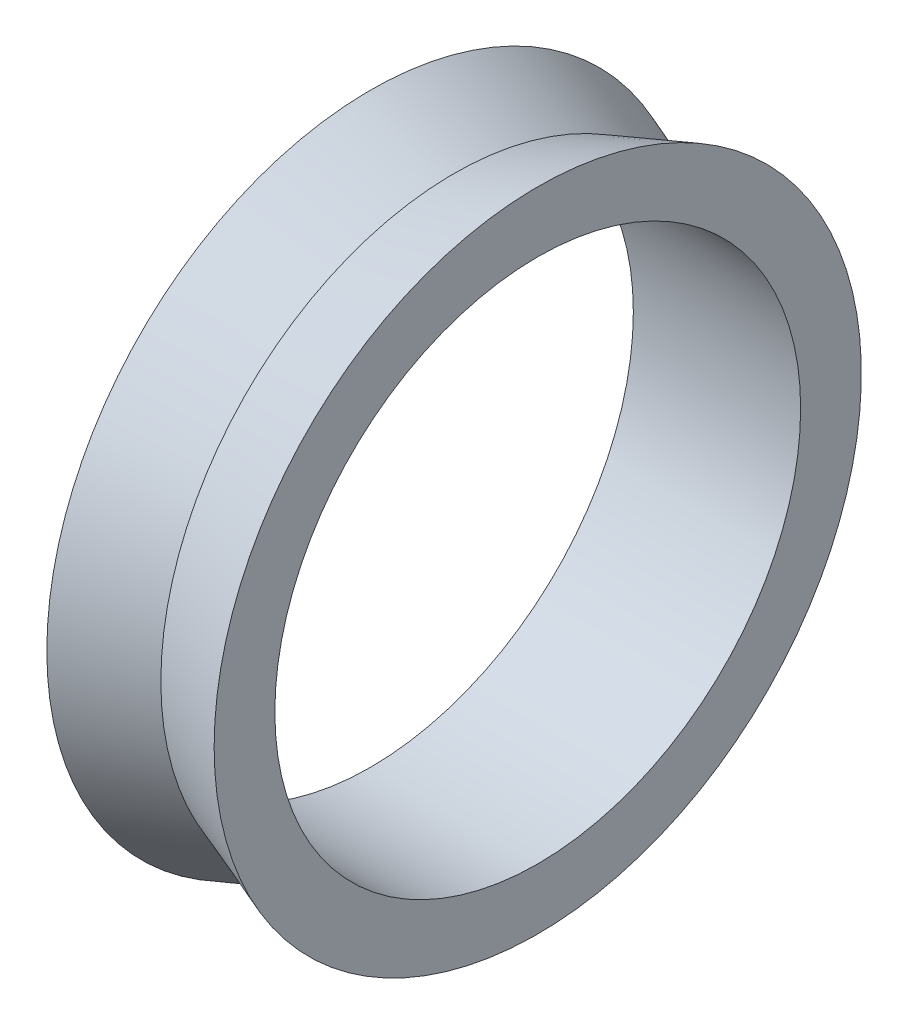
ISO-10303-21;
HEADER;
FILE_DESCRIPTION(('STEP AP214'),'2;1');
FILE_NAME('part.step','',(''),(''),'','','');
FILE_SCHEMA(('AUTOMOTIVE_DESIGN { 1 0 10303 214 1 1 1 1 }'));
ENDSEC;
DATA;
#1=APPLICATION_CONTEXT('core data for automotive mechanical design processes');
#2=APPLICATION_PROTOCOL_DEFINITION('international standard','automotive_design',2000,#1);
#3=PRODUCT_CONTEXT('',#1,'mechanical');
#4=PRODUCT('Part','Part','',(#3));
#5=PRODUCT_RELATED_PRODUCT_CATEGORY('part','',(#4));
#6=PRODUCT_DEFINITION_FORMATION('','',#4);
#7=PRODUCT_DEFINITION_CONTEXT('part definition',#1,'design');
#8=PRODUCT_DEFINITION('design','',#6,#7);
#9=PRODUCT_DEFINITION_SHAPE('','',#8);
#10=(LENGTH_UNIT() NAMED_UNIT(*) SI_UNIT(.MILLI.,.METRE.));
#11=(NAMED_UNIT(*) PLANE_ANGLE_UNIT() SI_UNIT($,.RADIAN.));
#12=(NAMED_UNIT(*) SI_UNIT($,.STERADIAN.) SOLID_ANGLE_UNIT());
#13=UNCERTAINTY_MEASURE_WITH_UNIT(LENGTH_MEASURE(1.E-05),#10,'distance_accuracy_value','');
#14=(GEOMETRIC_REPRESENTATION_CONTEXT(3) GLOBAL_UNCERTAINTY_ASSIGNED_CONTEXT((#13)) GLOBAL_UNIT_ASSIGNED_CONTEXT((#10,
#11,#12)) REPRESENTATION_CONTEXT('',''));
#15=CARTESIAN_POINT('',(0.,0.,0.));
#16=DIRECTION('',(0.,0.,1.));
#17=DIRECTION('',(1.,0.,0.));
#18=AXIS2_PLACEMENT_3D('',#15,#16,#17);
#19=CARTESIAN_POINT('',(0.,0.,0.));
#20=DIRECTION('',(-1.,0.,0.));
#21=DIRECTION('',(0.,0.,1.));
#22=AXIS2_PLACEMENT_3D('',#19,#20,#21);
#23=CYLINDRICAL_SURFACE('',#22,11.);
#24=CARTESIAN_POINT('',(3.5,0.,0.));
#25=DIRECTION('',(-1.,0.,0.));
#26=DIRECTION('',(0.,0.,1.));
#27=AXIS2_PLACEMENT_3D('',#24,#25,#26);
#28=CIRCLE('',#27,11.);
#29=CARTESIAN_POINT('',(3.5,0.,11.));
#30=VERTEX_POINT('',#29);
#31=EDGE_CURVE('E10',#30,#30,#28,.T.);
#32=ORIENTED_EDGE('',*,*,#31,.F.);
#33=EDGE_LOOP('',(#32));
#34=FACE_BOUND('',#33,.T.);
#35=CARTESIAN_POINT('',(-3.5,0.,0.));
#36=DIRECTION('',(-1.,0.,0.));
#37=DIRECTION('',(0.,0.,1.));
#38=AXIS2_PLACEMENT_3D('',#35,#36,#37);
#39=CIRCLE('',#38,11.);
#40=CARTESIAN_POINT('',(-3.5,0.,11.));
#41=VERTEX_POINT('',#40);
#42=EDGE_CURVE('E58',#41,#41,#39,.T.);
#43=ORIENTED_EDGE('',*,*,#42,.T.);
#44=EDGE_LOOP('',(#43));
#45=FACE_BOUND('',#44,.T.);
#46=ADVANCED_FACE('F39',(#34,#45),#23,.F.);
#47=CARTESIAN_POINT('',(3.5,0.,0.));
#48=DIRECTION('',(-1.,0.,0.));
#49=DIRECTION('',(0.,0.,1.));
#50=AXIS2_PLACEMENT_3D('',#47,#48,#49);
#51=PLANE('',#50);
#52=CARTESIAN_POINT('',(3.5,0.,0.));
#53=DIRECTION('',(-1.,0.,0.));
#54=DIRECTION('',(0.,0.,1.));
#55=AXIS2_PLACEMENT_3D('',#52,#53,#54);
#56=CIRCLE('',#55,13.54);
#57=CARTESIAN_POINT('',(3.5,0.,13.54));
#58=VERTEX_POINT('',#57);
#59=EDGE_CURVE('E45',#58,#58,#56,.T.);
#60=ORIENTED_EDGE('',*,*,#59,.F.);
#61=EDGE_LOOP('',(#60));
#62=FACE_BOUND('',#61,.T.);
#63=ORIENTED_EDGE('',*,*,#31,.T.);
#64=EDGE_LOOP('',(#63));
#65=FACE_BOUND('',#64,.T.);
#66=ADVANCED_FACE('F75',(#62,#65),#51,.F.);
#67=CARTESIAN_POINT('',(3.5,0.,0.));
#68=DIRECTION('',(1.,0.,0.));
#69=DIRECTION('',(0.,0.,-1.));
#70=AXIS2_PLACEMENT_3D('',#67,#68,#69);
#71=CONICAL_SURFACE('',#70,13.54,0.348082614523301);
#72=CARTESIAN_POINT('',(0.,0.,0.));
#73=DIRECTION('',(-1.,0.,0.));
#74=DIRECTION('',(0.,0.,1.));
#75=AXIS2_PLACEMENT_3D('',#72,#73,#74);
#76=CIRCLE('',#75,12.27);
#77=CARTESIAN_POINT('',(0.,0.,12.27));
#78=VERTEX_POINT('',#77);
#79=EDGE_CURVE('E49',#78,#78,#76,.T.);
#80=ORIENTED_EDGE('',*,*,#79,.F.);
#81=EDGE_LOOP('',(#80));
#82=FACE_BOUND('',#81,.T.);
#83=ORIENTED_EDGE('',*,*,#59,.T.);
#84=EDGE_LOOP('',(#83));
#85=FACE_BOUND('',#84,.T.);
#86=ADVANCED_FACE('F71',(#82,#85),#71,.T.);
#87=CARTESIAN_POINT('',(-3.5,0.,0.));
#88=DIRECTION('',(-1.,0.,0.));
#89=DIRECTION('',(0.,0.,1.));
#90=AXIS2_PLACEMENT_3D('',#87,#88,#89);
#91=CONICAL_SURFACE('',#90,13.54,0.348082614523301);
#92=ORIENTED_EDGE('',*,*,#79,.T.);
#93=EDGE_LOOP('',(#92));
#94=FACE_BOUND('',#93,.T.);
#95=CARTESIAN_POINT('',(-3.5,0.,0.));
#96=DIRECTION('',(-1.,0.,0.));
#97=DIRECTION('',(0.,0.,1.));
#98=AXIS2_PLACEMENT_3D('',#95,#96,#97);
#99=CIRCLE('',#98,13.54);
#100=CARTESIAN_POINT('',(-3.5,0.,13.54));
#101=VERTEX_POINT('',#100);
#102=EDGE_CURVE('E53',#101,#101,#99,.T.);
#103=ORIENTED_EDGE('',*,*,#102,.F.);
#104=EDGE_LOOP('',(#103));
#105=FACE_BOUND('',#104,.T.);
#106=ADVANCED_FACE('F65',(#94,#105),#91,.T.);
#107=CARTESIAN_POINT('',(-3.5,0.,0.));
#108=DIRECTION('',(-1.,0.,0.));
#109=DIRECTION('',(0.,0.,1.));
#110=AXIS2_PLACEMENT_3D('',#107,#108,#109);
#111=PLANE('',#110);
#112=ORIENTED_EDGE('',*,*,#102,.T.);
#113=EDGE_LOOP('',(#112));
#114=FACE_BOUND('',#113,.T.);
#115=ORIENTED_EDGE('',*,*,#42,.F.);
#116=EDGE_LOOP('',(#115));
#117=FACE_BOUND('',#116,.T.);
#118=ADVANCED_FACE('F63',(#114,#117),#111,.T.);
#119=CLOSED_SHELL('',(#46,#66,#86,#106,#118));
#120=MANIFOLD_SOLID_BREP('B2',#119);
#121=ADVANCED_BREP_SHAPE_REPRESENTATION('',(#18,#120),#14);
#122=SHAPE_DEFINITION_REPRESENTATION(#9,#121);
ENDSEC;
END-ISO-10303-21;
